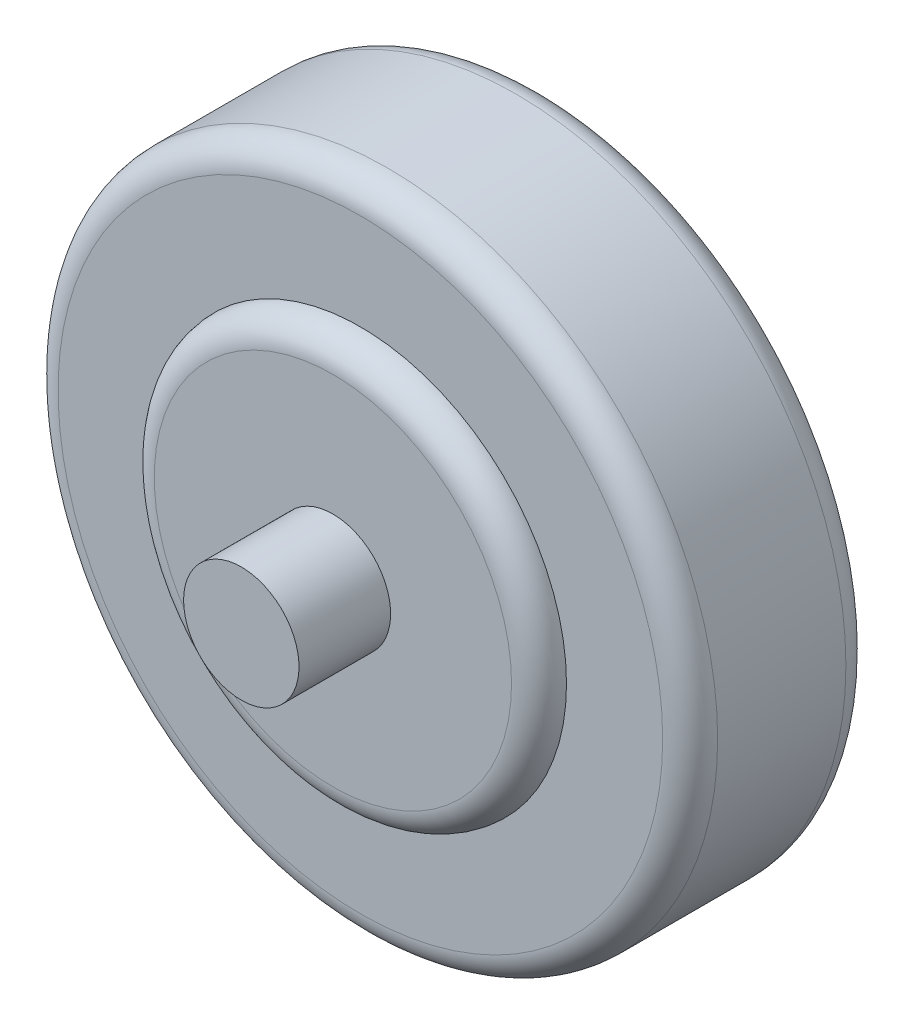
ISO-10303-21;
HEADER;
FILE_DESCRIPTION(('STEP AP214'),'2;1');
FILE_NAME('part.step','',(''),(''),'','','');
FILE_SCHEMA(('AUTOMOTIVE_DESIGN { 1 0 10303 214 1 1 1 1 }'));
ENDSEC;
DATA;
#1=APPLICATION_CONTEXT('core data for automotive mechanical design processes');
#2=APPLICATION_PROTOCOL_DEFINITION('international standard','automotive_design',2000,#1);
#3=PRODUCT_CONTEXT('',#1,'mechanical');
#4=PRODUCT('Part','Part','',(#3));
#5=PRODUCT_RELATED_PRODUCT_CATEGORY('part','',(#4));
#6=PRODUCT_DEFINITION_FORMATION('','',#4);
#7=PRODUCT_DEFINITION_CONTEXT('part definition',#1,'design');
#8=PRODUCT_DEFINITION('design','',#6,#7);
#9=PRODUCT_DEFINITION_SHAPE('','',#8);
#10=(LENGTH_UNIT() NAMED_UNIT(*) SI_UNIT(.MILLI.,.METRE.));
#11=(NAMED_UNIT(*) PLANE_ANGLE_UNIT() SI_UNIT($,.RADIAN.));
#12=(NAMED_UNIT(*) SI_UNIT($,.STERADIAN.) SOLID_ANGLE_UNIT());
#13=UNCERTAINTY_MEASURE_WITH_UNIT(LENGTH_MEASURE(1.E-05),#10,'distance_accuracy_value','');
#14=(GEOMETRIC_REPRESENTATION_CONTEXT(3) GLOBAL_UNCERTAINTY_ASSIGNED_CONTEXT((#13)) GLOBAL_UNIT_ASSIGNED_CONTEXT((#10,
#11,#12)) REPRESENTATION_CONTEXT('',''));
#15=CARTESIAN_POINT('',(0.,0.,0.));
#16=DIRECTION('',(0.,0.,1.));
#17=DIRECTION('',(1.,0.,0.));
#18=AXIS2_PLACEMENT_3D('',#15,#16,#17);
#19=CARTESIAN_POINT('',(0.,0.,200.));
#20=DIRECTION('',(0.,0.,-1.));
#21=DIRECTION('',(-1.,0.,0.));
#22=AXIS2_PLACEMENT_3D('',#19,#20,#21);
#23=CYLINDRICAL_SURFACE('',#22,360.);
#24=CARTESIAN_POINT('',(0.,0.,170.));
#25=DIRECTION('',(0.,0.,1.));
#26=DIRECTION('',(1.,0.,0.));
#27=AXIS2_PLACEMENT_3D('',#24,#25,#26);
#28=CIRCLE('',#27,360.);
#29=CARTESIAN_POINT('',(360.,0.,170.));
#30=VERTEX_POINT('',#29);
#31=EDGE_CURVE('E79',#30,#30,#28,.F.);
#32=ORIENTED_EDGE('',*,*,#31,.T.);
#33=EDGE_LOOP('',(#32));
#34=FACE_BOUND('',#33,.T.);
#35=CARTESIAN_POINT('',(0.,0.,30.));
#36=DIRECTION('',(0.,0.,1.));
#37=DIRECTION('',(1.,0.,0.));
#38=AXIS2_PLACEMENT_3D('',#35,#36,#37);
#39=CIRCLE('',#38,360.);
#40=CARTESIAN_POINT('',(360.,0.,30.));
#41=VERTEX_POINT('',#40);
#42=EDGE_CURVE('E83',#41,#41,#39,.T.);
#43=ORIENTED_EDGE('',*,*,#42,.T.);
#44=EDGE_LOOP('',(#43));
#45=FACE_BOUND('',#44,.T.);
#46=ADVANCED_FACE('F43',(#34,#45),#23,.T.);
#47=CARTESIAN_POINT('',(0.,0.,200.));
#48=DIRECTION('',(0.,0.,1.));
#49=DIRECTION('',(1.,0.,0.));
#50=AXIS2_PLACEMENT_3D('',#47,#48,#49);
#51=PLANE('',#50);
#52=CARTESIAN_POINT('',(0.,0.,200.));
#53=DIRECTION('',(0.,0.,1.));
#54=DIRECTION('',(1.,0.,0.));
#55=AXIS2_PLACEMENT_3D('',#52,#53,#54);
#56=CIRCLE('',#55,330.);
#57=CARTESIAN_POINT('',(330.,0.,200.));
#58=VERTEX_POINT('',#57);
#59=EDGE_CURVE('E87',#58,#58,#56,.T.);
#60=ORIENTED_EDGE('',*,*,#59,.T.);
#61=EDGE_LOOP('',(#60));
#62=FACE_BOUND('',#61,.T.);
#63=CARTESIAN_POINT('',(0.,0.,200.));
#64=DIRECTION('',(0.,0.,1.));
#65=DIRECTION('',(1.,0.,0.));
#66=AXIS2_PLACEMENT_3D('',#63,#64,#65);
#67=CIRCLE('',#66,225.);
#68=CARTESIAN_POINT('',(225.,0.,200.));
#69=VERTEX_POINT('',#68);
#70=EDGE_CURVE('E96',#69,#69,#67,.T.);
#71=ORIENTED_EDGE('',*,*,#70,.F.);
#72=EDGE_LOOP('',(#71));
#73=FACE_BOUND('',#72,.T.);
#74=ADVANCED_FACE('F124',(#62,#73),#51,.T.);
#75=CARTESIAN_POINT('',(0.,0.,0.));
#76=DIRECTION('',(0.,0.,1.));
#77=DIRECTION('',(1.,0.,0.));
#78=AXIS2_PLACEMENT_3D('',#75,#76,#77);
#79=PLANE('',#78);
#80=CARTESIAN_POINT('',(0.,0.,0.));
#81=DIRECTION('',(0.,0.,1.));
#82=DIRECTION('',(1.,0.,0.));
#83=AXIS2_PLACEMENT_3D('',#80,#81,#82);
#84=CIRCLE('',#83,231.886899345229);
#85=CARTESIAN_POINT('',(231.886899345229,0.,0.));
#86=VERTEX_POINT('',#85);
#87=EDGE_CURVE('E71',#86,#86,#84,.T.);
#88=ORIENTED_EDGE('',*,*,#87,.T.);
#89=EDGE_LOOP('',(#88));
#90=FACE_BOUND('',#89,.T.);
#91=CARTESIAN_POINT('',(0.,0.,0.));
#92=DIRECTION('',(0.,0.,1.));
#93=DIRECTION('',(1.,0.,0.));
#94=AXIS2_PLACEMENT_3D('',#91,#92,#93);
#95=CIRCLE('',#94,330.);
#96=CARTESIAN_POINT('',(330.,0.,0.));
#97=VERTEX_POINT('',#96);
#98=EDGE_CURVE('E75',#97,#97,#95,.F.);
#99=ORIENTED_EDGE('',*,*,#98,.T.);
#100=EDGE_LOOP('',(#99));
#101=FACE_BOUND('',#100,.T.);
#102=ADVANCED_FACE('F118',(#90,#101),#79,.F.);
#103=CARTESIAN_POINT('',(0.,0.,230.));
#104=DIRECTION('',(0.,0.,1.));
#105=DIRECTION('',(1.,0.,0.));
#106=AXIS2_PLACEMENT_3D('',#103,#104,#105);
#107=PLANE('',#106);
#108=CARTESIAN_POINT('',(0.,0.,230.));
#109=DIRECTION('',(0.,0.,1.));
#110=DIRECTION('',(1.,0.,0.));
#111=AXIS2_PLACEMENT_3D('',#108,#109,#110);
#112=CIRCLE('',#111,195.);
#113=CARTESIAN_POINT('',(195.,0.,230.));
#114=VERTEX_POINT('',#113);
#115=EDGE_CURVE('E91',#114,#114,#112,.T.);
#116=ORIENTED_EDGE('',*,*,#115,.T.);
#117=EDGE_LOOP('',(#116));
#118=FACE_BOUND('',#117,.T.);
#119=CARTESIAN_POINT('',(0.,0.,230.));
#120=DIRECTION('',(0.,0.,1.));
#121=DIRECTION('',(1.,0.,0.));
#122=AXIS2_PLACEMENT_3D('',#119,#120,#121);
#123=CIRCLE('',#122,63.);
#124=CARTESIAN_POINT('',(-63.,0.,230.));
#125=VERTEX_POINT('',#124);
#126=EDGE_CURVE('E95',#125,#125,#123,.T.);
#127=ORIENTED_EDGE('',*,*,#126,.F.);
#128=EDGE_LOOP('',(#127));
#129=FACE_BOUND('',#128,.T.);
#130=ADVANCED_FACE('F113',(#118,#129),#107,.T.);
#131=CARTESIAN_POINT('',(0.,0.,330.));
#132=DIRECTION('',(0.,0.,-1.));
#133=DIRECTION('',(-1.,0.,0.));
#134=AXIS2_PLACEMENT_3D('',#131,#132,#133);
#135=CYLINDRICAL_SURFACE('',#134,63.);
#136=CARTESIAN_POINT('',(0.,0.,330.));
#137=DIRECTION('',(0.,0.,1.));
#138=DIRECTION('',(1.,0.,0.));
#139=AXIS2_PLACEMENT_3D('',#136,#137,#138);
#140=CIRCLE('',#139,63.);
#141=CARTESIAN_POINT('',(-63.,0.,330.));
#142=VERTEX_POINT('',#141);
#143=EDGE_CURVE('E100',#142,#142,#140,.T.);
#144=CARTESIAN_POINT('',(-63.,0.,330.));
#145=CARTESIAN_POINT('',(-63.,0.,328.958333333333));
#146=CARTESIAN_POINT('',(-63.,0.,327.916666666667));
#147=CARTESIAN_POINT('',(-63.,0.,325.833333333333));
#148=CARTESIAN_POINT('',(-63.,0.,324.791666666667));
#149=CARTESIAN_POINT('',(-63.,0.,322.708333333333));
#150=CARTESIAN_POINT('',(-63.,0.,321.666666666667));
#151=CARTESIAN_POINT('',(-63.,0.,319.583333333333));
#152=CARTESIAN_POINT('',(-63.,0.,318.541666666667));
#153=CARTESIAN_POINT('',(-63.,0.,316.458333333333));
#154=CARTESIAN_POINT('',(-63.,0.,315.416666666667));
#155=CARTESIAN_POINT('',(-63.,0.,313.333333333333));
#156=CARTESIAN_POINT('',(-63.,0.,312.291666666667));
#157=CARTESIAN_POINT('',(-63.,0.,310.208333333333));
#158=CARTESIAN_POINT('',(-63.,0.,309.166666666667));
#159=CARTESIAN_POINT('',(-63.,0.,307.083333333333));
#160=CARTESIAN_POINT('',(-63.,0.,306.041666666667));
#161=CARTESIAN_POINT('',(-63.,0.,303.958333333333));
#162=CARTESIAN_POINT('',(-63.,0.,302.916666666667));
#163=CARTESIAN_POINT('',(-63.,0.,300.833333333333));
#164=CARTESIAN_POINT('',(-63.,0.,299.791666666667));
#165=CARTESIAN_POINT('',(-63.,0.,297.708333333333));
#166=CARTESIAN_POINT('',(-63.,0.,296.666666666667));
#167=CARTESIAN_POINT('',(-63.,0.,294.583333333333));
#168=CARTESIAN_POINT('',(-63.,0.,293.541666666667));
#169=CARTESIAN_POINT('',(-63.,0.,291.458333333333));
#170=CARTESIAN_POINT('',(-63.,0.,290.416666666667));
#171=CARTESIAN_POINT('',(-63.,0.,288.333333333333));
#172=CARTESIAN_POINT('',(-63.,0.,287.291666666667));
#173=CARTESIAN_POINT('',(-63.,0.,285.208333333333));
#174=CARTESIAN_POINT('',(-63.,0.,284.166666666667));
#175=CARTESIAN_POINT('',(-63.,0.,282.083333333333));
#176=CARTESIAN_POINT('',(-63.,0.,281.041666666667));
#177=CARTESIAN_POINT('',(-63.,0.,278.958333333333));
#178=CARTESIAN_POINT('',(-63.,0.,277.916666666667));
#179=CARTESIAN_POINT('',(-63.,0.,275.833333333333));
#180=CARTESIAN_POINT('',(-63.,0.,274.791666666667));
#181=CARTESIAN_POINT('',(-63.,0.,272.708333333333));
#182=CARTESIAN_POINT('',(-63.,0.,271.666666666667));
#183=CARTESIAN_POINT('',(-63.,0.,269.583333333333));
#184=CARTESIAN_POINT('',(-63.,0.,268.541666666667));
#185=CARTESIAN_POINT('',(-63.,0.,266.458333333333));
#186=CARTESIAN_POINT('',(-63.,0.,265.416666666667));
#187=CARTESIAN_POINT('',(-63.,0.,263.333333333333));
#188=CARTESIAN_POINT('',(-63.,0.,262.291666666667));
#189=CARTESIAN_POINT('',(-63.,0.,260.208333333333));
#190=CARTESIAN_POINT('',(-63.,0.,259.166666666667));
#191=CARTESIAN_POINT('',(-63.,0.,257.083333333333));
#192=CARTESIAN_POINT('',(-63.,0.,256.041666666667));
#193=CARTESIAN_POINT('',(-63.,0.,253.958333333333));
#194=CARTESIAN_POINT('',(-63.,0.,252.916666666667));
#195=CARTESIAN_POINT('',(-63.,0.,250.833333333333));
#196=CARTESIAN_POINT('',(-63.,0.,249.791666666667));
#197=CARTESIAN_POINT('',(-63.,0.,247.708333333333));
#198=CARTESIAN_POINT('',(-63.,0.,246.666666666667));
#199=CARTESIAN_POINT('',(-63.,0.,244.583333333333));
#200=CARTESIAN_POINT('',(-63.,0.,243.541666666667));
#201=CARTESIAN_POINT('',(-63.,0.,241.458333333333));
#202=CARTESIAN_POINT('',(-63.,0.,240.416666666667));
#203=CARTESIAN_POINT('',(-63.,0.,238.333333333333));
#204=CARTESIAN_POINT('',(-63.,0.,237.291666666667));
#205=CARTESIAN_POINT('',(-63.,0.,235.208333333333));
#206=CARTESIAN_POINT('',(-63.,0.,234.166666666667));
#207=CARTESIAN_POINT('',(-63.,0.,232.083333333333));
#208=CARTESIAN_POINT('',(-63.,0.,231.041666666667));
#209=CARTESIAN_POINT('',(-63.,0.,230.));
#210=B_SPLINE_CURVE_WITH_KNOTS('',3,(#144,#145,#146,#147,#148,#149,#150,#151,#152,#153,#154,
#155,#156,#157,#158,#159,#160,#161,#162,#163,#164,#165,#166,#167,#168,#169,#170,#171,#172,#173,
#174,#175,#176,#177,#178,#179,#180,#181,#182,#183,#184,#185,#186,#187,#188,#189,#190,#191,#192,
#193,#194,#195,#196,#197,#198,#199,#200,#201,#202,#203,#204,#205,#206,#207,#208,#209),
.UNSPECIFIED.,.F.,.F.,(4,2,2,2,2,2,2,2,2,2,2,2,2,2,2,2,2,2,2,2,2,2,2,2,2,2,2,2,2,2,2,2,4),(0.,
3.12500000000004,6.25000000000003,9.37500000000002,12.5,15.625,18.75,21.875,25.,28.125,31.25,
34.375,37.5,40.625,43.75,46.875,50.,53.125,56.25,59.375,62.5,65.625,68.75,71.875,75.,78.125,
81.25,84.375,87.5,90.625,93.75,96.875,100.),.UNSPECIFIED.);
#211=EDGE_CURVE('BSEAM110',#142,#125,#210,.T.);
#212=ORIENTED_EDGE('',*,*,#143,.F.);
#213=ORIENTED_EDGE('',*,*,#126,.T.);
#214=ORIENTED_EDGE('',*,*,#211,.T.);
#215=ORIENTED_EDGE('',*,*,#211,.F.);
#216=EDGE_LOOP('',(#212,#214,#213,#215));
#217=FACE_BOUND('',#216,.T.);
#218=ADVANCED_FACE('F110',(#217),#135,.T.);
#219=CARTESIAN_POINT('',(0.,0.,330.));
#220=DIRECTION('',(0.,0.,1.));
#221=DIRECTION('',(1.,0.,0.));
#222=AXIS2_PLACEMENT_3D('',#219,#220,#221);
#223=PLANE('',#222);
#224=ORIENTED_EDGE('',*,*,#143,.T.);
#225=EDGE_LOOP('',(#224));
#226=FACE_BOUND('',#225,.T.);
#227=ADVANCED_FACE('F108',(#226),#223,.T.);
#228=CARTESIAN_POINT('',(0.,0.,200.));
#229=DIRECTION('',(0.,0.,1.));
#230=DIRECTION('',(1.,0.,0.));
#231=AXIS2_PLACEMENT_3D('',#228,#229,#230);
#232=TOROIDAL_SURFACE('',#231,195.,30.);
#233=ORIENTED_EDGE('',*,*,#70,.T.);
#234=EDGE_LOOP('',(#233));
#235=FACE_BOUND('',#234,.T.);
#236=ORIENTED_EDGE('',*,*,#115,.F.);
#237=EDGE_LOOP('',(#236));
#238=FACE_BOUND('',#237,.T.);
#239=ADVANCED_FACE('F137',(#235,#238),#232,.T.);
#240=CARTESIAN_POINT('',(0.,0.,170.));
#241=DIRECTION('',(0.,0.,1.));
#242=DIRECTION('',(1.,0.,0.));
#243=AXIS2_PLACEMENT_3D('',#240,#241,#242);
#244=TOROIDAL_SURFACE('',#243,330.,30.);
#245=ORIENTED_EDGE('',*,*,#31,.F.);
#246=EDGE_LOOP('',(#245));
#247=FACE_BOUND('',#246,.T.);
#248=ORIENTED_EDGE('',*,*,#59,.F.);
#249=EDGE_LOOP('',(#248));
#250=FACE_BOUND('',#249,.T.);
#251=ADVANCED_FACE('F140',(#247,#250),#244,.T.);
#252=CARTESIAN_POINT('',(0.,0.,30.));
#253=DIRECTION('',(0.,0.,1.));
#254=DIRECTION('',(1.,0.,0.));
#255=AXIS2_PLACEMENT_3D('',#252,#253,#254);
#256=TOROIDAL_SURFACE('',#255,330.,30.);
#257=ORIENTED_EDGE('',*,*,#98,.F.);
#258=EDGE_LOOP('',(#257));
#259=FACE_BOUND('',#258,.T.);
#260=ORIENTED_EDGE('',*,*,#42,.F.);
#261=EDGE_LOOP('',(#260));
#262=FACE_BOUND('',#261,.T.);
#263=ADVANCED_FACE('F144',(#259,#262),#256,.T.);
#264=CARTESIAN_POINT('',(0.,0.,40.));
#265=DIRECTION('',(0.,0.,-1.));
#266=DIRECTION('',(-1.,0.,0.));
#267=AXIS2_PLACEMENT_3D('',#264,#265,#266);
#268=PLANE('',#267);
#269=CARTESIAN_POINT('',(0.,0.,40.));
#270=DIRECTION('',(0.,0.,-1.));
#271=DIRECTION('',(-1.,0.,0.));
#272=AXIS2_PLACEMENT_3D('',#269,#270,#271);
#273=CIRCLE('',#272,119.311171206172);
#274=CARTESIAN_POINT('',(-119.311171206172,0.,40.));
#275=VERTEX_POINT('',#274);
#276=EDGE_CURVE('E56',#275,#275,#273,.F.);
#277=ORIENTED_EDGE('',*,*,#276,.T.);
#278=EDGE_LOOP('',(#277));
#279=FACE_BOUND('',#278,.T.);
#280=CARTESIAN_POINT('',(0.,0.,40.));
#281=DIRECTION('',(0.,0.,-1.));
#282=DIRECTION('',(-1.,0.,0.));
#283=AXIS2_PLACEMENT_3D('',#280,#281,#282);
#284=CIRCLE('',#283,175.318356850306);
#285=CARTESIAN_POINT('',(-175.318356850306,0.,40.));
#286=VERTEX_POINT('',#285);
#287=EDGE_CURVE('E67',#286,#286,#284,.T.);
#288=ORIENTED_EDGE('',*,*,#287,.T.);
#289=EDGE_LOOP('',(#288));
#290=FACE_BOUND('',#289,.T.);
#291=ADVANCED_FACE('F148',(#279,#290),#268,.T.);
#292=CARTESIAN_POINT('',(0.,0.,30.));
#293=DIRECTION('',(0.,0.,1.));
#294=DIRECTION('',(1.,0.,0.));
#295=AXIS2_PLACEMENT_3D('',#292,#293,#294);
#296=TOROIDAL_SURFACE('',#295,231.886899345229,30.);
#297=CARTESIAN_POINT('',(0.,0.,20.));
#298=DIRECTION('',(0.,0.,1.));
#299=DIRECTION('',(1.,0.,0.));
#300=AXIS2_PLACEMENT_3D('',#297,#298,#299);
#301=CIRCLE('',#300,203.602628097767);
#302=CARTESIAN_POINT('',(203.602628097767,0.,20.));
#303=VERTEX_POINT('',#302);
#304=EDGE_CURVE('E61',#303,#303,#301,.T.);
#305=ORIENTED_EDGE('',*,*,#304,.T.);
#306=EDGE_LOOP('',(#305));
#307=FACE_BOUND('',#306,.T.);
#308=ORIENTED_EDGE('',*,*,#87,.F.);
#309=EDGE_LOOP('',(#308));
#310=FACE_BOUND('',#309,.T.);
#311=ADVANCED_FACE('F150',(#307,#310),#296,.T.);
#312=CARTESIAN_POINT('',(0.,0.,10.));
#313=DIRECTION('',(0.,0.,1.));
#314=DIRECTION('',(1.,0.,0.));
#315=AXIS2_PLACEMENT_3D('',#312,#313,#314);
#316=TOROIDAL_SURFACE('',#315,175.318356850306,30.);
#317=ORIENTED_EDGE('',*,*,#304,.F.);
#318=EDGE_LOOP('',(#317));
#319=FACE_BOUND('',#318,.T.);
#320=ORIENTED_EDGE('',*,*,#287,.F.);
#321=EDGE_LOOP('',(#320));
#322=FACE_BOUND('',#321,.T.);
#323=ADVANCED_FACE('F153',(#319,#322),#316,.F.);
#324=CARTESIAN_POINT('',(0.,0.,10.));
#325=DIRECTION('',(0.,0.,-1.));
#326=DIRECTION('',(-1.,0.,0.));
#327=AXIS2_PLACEMENT_3D('',#324,#325,#326);
#328=PLANE('',#327);
#329=CARTESIAN_POINT('',(0.,0.,10.));
#330=DIRECTION('',(0.,0.,-1.));
#331=DIRECTION('',(-1.,0.,0.));
#332=AXIS2_PLACEMENT_3D('',#329,#330,#331);
#333=CIRCLE('',#332,67.3496469791055);
#334=CARTESIAN_POINT('',(-67.3496469791055,0.,10.));
#335=VERTEX_POINT('',#334);
#336=EDGE_CURVE('E51',#335,#335,#333,.T.);
#337=ORIENTED_EDGE('',*,*,#336,.T.);
#338=EDGE_LOOP('',(#337));
#339=FACE_BOUND('',#338,.T.);
#340=ADVANCED_FACE('F156',(#339),#328,.T.);
#341=CARTESIAN_POINT('',(0.,0.,10.));
#342=DIRECTION('',(0.,0.,-1.));
#343=DIRECTION('',(-1.,0.,0.));
#344=AXIS2_PLACEMENT_3D('',#341,#342,#343);
#345=TOROIDAL_SURFACE('',#344,119.311171206172,30.);
#346=CARTESIAN_POINT('',(0.,0.,25.));
#347=DIRECTION('',(0.,0.,-1.));
#348=DIRECTION('',(-1.,0.,0.));
#349=AXIS2_PLACEMENT_3D('',#346,#347,#348);
#350=CIRCLE('',#349,93.3304090926387);
#351=CARTESIAN_POINT('',(-93.3304090926387,0.,25.));
#352=VERTEX_POINT('',#351);
#353=EDGE_CURVE('E10',#352,#352,#350,.F.);
#354=ORIENTED_EDGE('',*,*,#353,.T.);
#355=EDGE_LOOP('',(#354));
#356=FACE_BOUND('',#355,.T.);
#357=ORIENTED_EDGE('',*,*,#276,.F.);
#358=EDGE_LOOP('',(#357));
#359=FACE_BOUND('',#358,.T.);
#360=ADVANCED_FACE('F158',(#356,#359),#345,.F.);
#361=CARTESIAN_POINT('',(0.,0.,40.));
#362=DIRECTION('',(0.,0.,1.));
#363=DIRECTION('',(1.,0.,0.));
#364=AXIS2_PLACEMENT_3D('',#361,#362,#363);
#365=TOROIDAL_SURFACE('',#364,67.3496469791055,30.);
#366=ORIENTED_EDGE('',*,*,#353,.F.);
#367=EDGE_LOOP('',(#366));
#368=FACE_BOUND('',#367,.T.);
#369=ORIENTED_EDGE('',*,*,#336,.F.);
#370=EDGE_LOOP('',(#369));
#371=FACE_BOUND('',#370,.T.);
#372=ADVANCED_FACE('F45',(#368,#371),#365,.T.);
#373=CLOSED_SHELL('',(#46,#74,#102,#130,#218,#227,#239,#251,#263,#291,#311,#323,#340,#360,#372));
#374=MANIFOLD_SOLID_BREP('B2',#373);
#375=ADVANCED_BREP_SHAPE_REPRESENTATION('',(#18,#374),#14);
#376=SHAPE_DEFINITION_REPRESENTATION(#9,#375);
ENDSEC;
END-ISO-10303-21;
